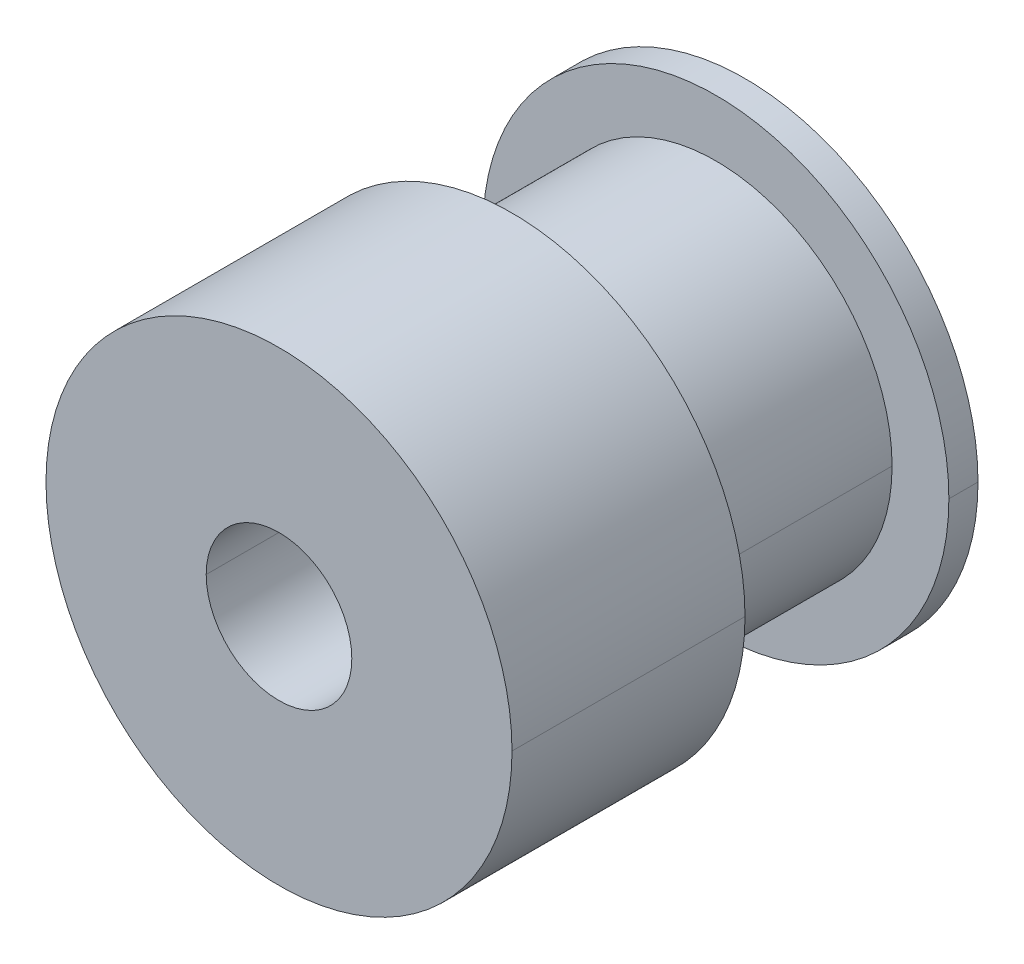
ISO-10303-21;
HEADER;
FILE_DESCRIPTION(('STEP AP214'),'2;1');
FILE_NAME('part.step','',(''),(''),'','','');
FILE_SCHEMA(('AUTOMOTIVE_DESIGN { 1 0 10303 214 1 1 1 1 }'));
ENDSEC;
DATA;
#1=APPLICATION_CONTEXT('core data for automotive mechanical design processes');
#2=APPLICATION_PROTOCOL_DEFINITION('international standard','automotive_design',2000,#1);
#3=PRODUCT_CONTEXT('',#1,'mechanical');
#4=PRODUCT('Part','Part','',(#3));
#5=PRODUCT_RELATED_PRODUCT_CATEGORY('part','',(#4));
#6=PRODUCT_DEFINITION_FORMATION('','',#4);
#7=PRODUCT_DEFINITION_CONTEXT('part definition',#1,'design');
#8=PRODUCT_DEFINITION('design','',#6,#7);
#9=PRODUCT_DEFINITION_SHAPE('','',#8);
#10=(LENGTH_UNIT() NAMED_UNIT(*) SI_UNIT(.MILLI.,.METRE.));
#11=(NAMED_UNIT(*) PLANE_ANGLE_UNIT() SI_UNIT($,.RADIAN.));
#12=(NAMED_UNIT(*) SI_UNIT($,.STERADIAN.) SOLID_ANGLE_UNIT());
#13=UNCERTAINTY_MEASURE_WITH_UNIT(LENGTH_MEASURE(1.E-05),#10,'distance_accuracy_value','');
#14=(GEOMETRIC_REPRESENTATION_CONTEXT(3) GLOBAL_UNCERTAINTY_ASSIGNED_CONTEXT((#13)) GLOBAL_UNIT_ASSIGNED_CONTEXT((#10,
#11,#12)) REPRESENTATION_CONTEXT('',''));
#15=CARTESIAN_POINT('',(0.,0.,0.));
#16=DIRECTION('',(0.,0.,1.));
#17=DIRECTION('',(1.,0.,0.));
#18=AXIS2_PLACEMENT_3D('',#15,#16,#17);
#19=CARTESIAN_POINT('',(0.,0.,8.));
#20=DIRECTION('',(0.,0.,1.));
#21=DIRECTION('',(1.,0.,0.));
#22=AXIS2_PLACEMENT_3D('',#19,#20,#21);
#23=CYLINDRICAL_SURFACE('',#22,8.);
#24=DIRECTION('',(0.,0.,1.));
#25=VECTOR('',#24,1.);
#26=CARTESIAN_POINT('',(-8.,0.,8.));
#27=LINE('',#26,#25);
#28=CARTESIAN_POINT('',(-8.,0.,0.));
#29=VERTEX_POINT('',#28);
#30=CARTESIAN_POINT('',(-8.,0.,1.));
#31=VERTEX_POINT('',#30);
#32=EDGE_CURVE('E39',#29,#31,#27,.T.);
#33=ORIENTED_EDGE('',*,*,#32,.F.);
#34=CARTESIAN_POINT('',(0.,0.,0.));
#35=DIRECTION('',(0.,0.,1.));
#36=DIRECTION('',(1.,0.,0.));
#37=AXIS2_PLACEMENT_3D('',#34,#35,#36);
#38=CIRCLE('',#37,8.);
#39=CARTESIAN_POINT('',(8.,0.,0.));
#40=VERTEX_POINT('',#39);
#41=EDGE_CURVE('E10',#29,#40,#38,.T.);
#42=ORIENTED_EDGE('',*,*,#41,.T.);
#43=DIRECTION('',(0.,0.,1.));
#44=VECTOR('',#43,1.);
#45=CARTESIAN_POINT('',(8.,0.,8.));
#46=LINE('',#45,#44);
#47=CARTESIAN_POINT('',(8.,0.,1.));
#48=VERTEX_POINT('',#47);
#49=EDGE_CURVE('E26',#40,#48,#46,.T.);
#50=ORIENTED_EDGE('',*,*,#49,.T.);
#51=CARTESIAN_POINT('',(0.,0.,1.));
#52=DIRECTION('',(0.,0.,1.));
#53=DIRECTION('',(1.,0.,0.));
#54=AXIS2_PLACEMENT_3D('',#51,#52,#53);
#55=CIRCLE('',#54,8.);
#56=EDGE_CURVE('E155',#31,#48,#55,.T.);
#57=ORIENTED_EDGE('',*,*,#56,.F.);
#58=EDGE_LOOP('',(#33,#42,#50,#57));
#59=FACE_BOUND('',#58,.T.);
#60=ADVANCED_FACE('F15',(#59),#23,.T.);
#61=CARTESIAN_POINT('',(0.,0.,8.));
#62=DIRECTION('',(0.,0.,1.));
#63=DIRECTION('',(1.,0.,0.));
#64=AXIS2_PLACEMENT_3D('',#61,#62,#63);
#65=CYLINDRICAL_SURFACE('',#64,8.);
#66=DIRECTION('',(0.,0.,1.));
#67=VECTOR('',#66,1.);
#68=CARTESIAN_POINT('',(8.,0.,8.));
#69=LINE('',#68,#67);
#70=CARTESIAN_POINT('',(8.,0.,8.));
#71=VERTEX_POINT('',#70);
#72=CARTESIAN_POINT('',(8.,0.,16.));
#73=VERTEX_POINT('',#72);
#74=EDGE_CURVE('E160',#71,#73,#69,.T.);
#75=ORIENTED_EDGE('',*,*,#74,.T.);
#76=CARTESIAN_POINT('',(0.,0.,16.));
#77=DIRECTION('',(0.,0.,1.));
#78=DIRECTION('',(1.,0.,0.));
#79=AXIS2_PLACEMENT_3D('',#76,#77,#78);
#80=CIRCLE('',#79,8.);
#81=CARTESIAN_POINT('',(-8.,0.,16.));
#82=VERTEX_POINT('',#81);
#83=EDGE_CURVE('E54',#82,#73,#80,.T.);
#84=ORIENTED_EDGE('',*,*,#83,.F.);
#85=DIRECTION('',(0.,0.,1.));
#86=VECTOR('',#85,1.);
#87=CARTESIAN_POINT('',(-8.,0.,8.));
#88=LINE('',#87,#86);
#89=CARTESIAN_POINT('',(-8.,0.,8.));
#90=VERTEX_POINT('',#89);
#91=EDGE_CURVE('E66',#90,#82,#88,.T.);
#92=ORIENTED_EDGE('',*,*,#91,.F.);
#93=CARTESIAN_POINT('',(0.,0.,8.));
#94=DIRECTION('',(0.,0.,1.));
#95=DIRECTION('',(1.,0.,0.));
#96=AXIS2_PLACEMENT_3D('',#93,#94,#95);
#97=CIRCLE('',#96,8.);
#98=EDGE_CURVE('E163',#90,#71,#97,.T.);
#99=ORIENTED_EDGE('',*,*,#98,.T.);
#100=EDGE_LOOP('',(#75,#84,#92,#99));
#101=FACE_BOUND('',#100,.T.);
#102=ADVANCED_FACE('F208',(#101),#65,.T.);
#103=CARTESIAN_POINT('',(0.,0.,8.));
#104=DIRECTION('',(0.,0.,1.));
#105=DIRECTION('',(1.,0.,0.));
#106=AXIS2_PLACEMENT_3D('',#103,#104,#105);
#107=CYLINDRICAL_SURFACE('',#106,8.);
#108=ORIENTED_EDGE('',*,*,#49,.F.);
#109=CARTESIAN_POINT('',(0.,0.,0.));
#110=DIRECTION('',(0.,0.,1.));
#111=DIRECTION('',(1.,0.,0.));
#112=AXIS2_PLACEMENT_3D('',#109,#110,#111);
#113=CIRCLE('',#112,8.);
#114=EDGE_CURVE('E166',#40,#29,#113,.T.);
#115=ORIENTED_EDGE('',*,*,#114,.T.);
#116=ORIENTED_EDGE('',*,*,#32,.T.);
#117=CARTESIAN_POINT('',(0.,0.,1.));
#118=DIRECTION('',(0.,0.,1.));
#119=DIRECTION('',(1.,0.,0.));
#120=AXIS2_PLACEMENT_3D('',#117,#118,#119);
#121=CIRCLE('',#120,8.);
#122=EDGE_CURVE('E151',#48,#31,#121,.T.);
#123=ORIENTED_EDGE('',*,*,#122,.F.);
#124=EDGE_LOOP('',(#108,#115,#116,#123));
#125=FACE_BOUND('',#124,.T.);
#126=ADVANCED_FACE('F187',(#125),#107,.T.);
#127=CARTESIAN_POINT('',(0.,0.,8.));
#128=DIRECTION('',(0.,0.,1.));
#129=DIRECTION('',(1.,0.,0.));
#130=AXIS2_PLACEMENT_3D('',#127,#128,#129);
#131=CYLINDRICAL_SURFACE('',#130,8.);
#132=ORIENTED_EDGE('',*,*,#91,.T.);
#133=CARTESIAN_POINT('',(0.,0.,16.));
#134=DIRECTION('',(0.,0.,1.));
#135=DIRECTION('',(1.,0.,0.));
#136=AXIS2_PLACEMENT_3D('',#133,#134,#135);
#137=CIRCLE('',#136,8.);
#138=EDGE_CURVE('E156',#73,#82,#137,.T.);
#139=ORIENTED_EDGE('',*,*,#138,.F.);
#140=ORIENTED_EDGE('',*,*,#74,.F.);
#141=CARTESIAN_POINT('',(0.,0.,8.));
#142=DIRECTION('',(0.,0.,1.));
#143=DIRECTION('',(1.,0.,0.));
#144=AXIS2_PLACEMENT_3D('',#141,#142,#143);
#145=CIRCLE('',#144,8.);
#146=EDGE_CURVE('E129',#71,#90,#145,.T.);
#147=ORIENTED_EDGE('',*,*,#146,.T.);
#148=EDGE_LOOP('',(#132,#139,#140,#147));
#149=FACE_BOUND('',#148,.T.);
#150=ADVANCED_FACE('F301',(#149),#131,.T.);
#151=CARTESIAN_POINT('',(0.,0.,8.));
#152=DIRECTION('',(0.,0.,1.));
#153=DIRECTION('',(1.,0.,0.));
#154=AXIS2_PLACEMENT_3D('',#151,#152,#153);
#155=PLANE('',#154);
#156=ORIENTED_EDGE('',*,*,#146,.F.);
#157=ORIENTED_EDGE('',*,*,#98,.F.);
#158=EDGE_LOOP('',(#156,#157));
#159=FACE_BOUND('',#158,.T.);
#160=CARTESIAN_POINT('',(0.,0.,8.));
#161=DIRECTION('',(0.,0.,1.));
#162=DIRECTION('',(1.,0.,0.));
#163=AXIS2_PLACEMENT_3D('',#160,#161,#162);
#164=CIRCLE('',#163,6.05023877008);
#165=CARTESIAN_POINT('',(6.05023877008,0.,8.));
#166=VERTEX_POINT('',#165);
#167=CARTESIAN_POINT('',(-6.05023877008,0.,8.));
#168=VERTEX_POINT('',#167);
#169=EDGE_CURVE('E119',#166,#168,#164,.T.);
#170=ORIENTED_EDGE('',*,*,#169,.T.);
#171=CARTESIAN_POINT('',(0.,0.,8.));
#172=DIRECTION('',(0.,0.,1.));
#173=DIRECTION('',(1.,0.,0.));
#174=AXIS2_PLACEMENT_3D('',#171,#172,#173);
#175=CIRCLE('',#174,6.05023877008);
#176=EDGE_CURVE('E117',#168,#166,#175,.T.);
#177=ORIENTED_EDGE('',*,*,#176,.T.);
#178=EDGE_LOOP('',(#170,#177));
#179=FACE_BOUND('',#178,.T.);
#180=ADVANCED_FACE('F17',(#159,#179),#155,.F.);
#181=CARTESIAN_POINT('',(0.,0.,4.5));
#182=DIRECTION('',(0.,0.,1.));
#183=DIRECTION('',(1.,0.,0.));
#184=AXIS2_PLACEMENT_3D('',#181,#182,#183);
#185=CYLINDRICAL_SURFACE('',#184,6.05023877008);
#186=DIRECTION('',(0.,0.,1.));
#187=VECTOR('',#186,1.);
#188=CARTESIAN_POINT('',(-6.05023877008,0.,4.5));
#189=LINE('',#188,#187);
#190=CARTESIAN_POINT('',(-6.05023877008,0.,1.));
#191=VERTEX_POINT('',#190);
#192=EDGE_CURVE('E19',#191,#168,#189,.T.);
#193=ORIENTED_EDGE('',*,*,#192,.F.);
#194=CARTESIAN_POINT('',(0.,0.,1.));
#195=DIRECTION('',(0.,0.,1.));
#196=DIRECTION('',(1.,0.,0.));
#197=AXIS2_PLACEMENT_3D('',#194,#195,#196);
#198=CIRCLE('',#197,6.05023877008);
#199=CARTESIAN_POINT('',(6.05023877008,0.,1.));
#200=VERTEX_POINT('',#199);
#201=EDGE_CURVE('E122',#191,#200,#198,.T.);
#202=ORIENTED_EDGE('',*,*,#201,.T.);
#203=DIRECTION('',(0.,0.,1.));
#204=VECTOR('',#203,1.);
#205=CARTESIAN_POINT('',(6.05023877008,0.,4.5));
#206=LINE('',#205,#204);
#207=EDGE_CURVE('E127',#200,#166,#206,.T.);
#208=ORIENTED_EDGE('',*,*,#207,.T.);
#209=ORIENTED_EDGE('',*,*,#176,.F.);
#210=EDGE_LOOP('',(#193,#202,#208,#209));
#211=FACE_BOUND('',#210,.T.);
#212=ADVANCED_FACE('F131',(#211),#185,.T.);
#213=CARTESIAN_POINT('',(0.,0.,4.5));
#214=DIRECTION('',(0.,0.,1.));
#215=DIRECTION('',(1.,0.,0.));
#216=AXIS2_PLACEMENT_3D('',#213,#214,#215);
#217=CYLINDRICAL_SURFACE('',#216,6.05023877008);
#218=ORIENTED_EDGE('',*,*,#207,.F.);
#219=CARTESIAN_POINT('',(0.,0.,1.));
#220=DIRECTION('',(0.,0.,1.));
#221=DIRECTION('',(1.,0.,0.));
#222=AXIS2_PLACEMENT_3D('',#219,#220,#221);
#223=CIRCLE('',#222,6.05023877008);
#224=EDGE_CURVE('E134',#200,#191,#223,.T.);
#225=ORIENTED_EDGE('',*,*,#224,.T.);
#226=ORIENTED_EDGE('',*,*,#192,.T.);
#227=ORIENTED_EDGE('',*,*,#169,.F.);
#228=EDGE_LOOP('',(#218,#225,#226,#227));
#229=FACE_BOUND('',#228,.T.);
#230=ADVANCED_FACE('F125',(#229),#217,.T.);
#231=CARTESIAN_POINT('',(0.,0.,1.));
#232=DIRECTION('',(0.,0.,1.));
#233=DIRECTION('',(1.,0.,0.));
#234=AXIS2_PLACEMENT_3D('',#231,#232,#233);
#235=PLANE('',#234);
#236=ORIENTED_EDGE('',*,*,#56,.T.);
#237=ORIENTED_EDGE('',*,*,#122,.T.);
#238=EDGE_LOOP('',(#236,#237));
#239=FACE_BOUND('',#238,.T.);
#240=ORIENTED_EDGE('',*,*,#201,.F.);
#241=ORIENTED_EDGE('',*,*,#224,.F.);
#242=EDGE_LOOP('',(#240,#241));
#243=FACE_BOUND('',#242,.T.);
#244=ADVANCED_FACE('F193',(#239,#243),#235,.T.);
#245=CARTESIAN_POINT('',(0.,0.,16.));
#246=DIRECTION('',(0.,0.,1.));
#247=DIRECTION('',(1.,0.,0.));
#248=AXIS2_PLACEMENT_3D('',#245,#246,#247);
#249=PLANE('',#248);
#250=ORIENTED_EDGE('',*,*,#138,.T.);
#251=ORIENTED_EDGE('',*,*,#83,.T.);
#252=EDGE_LOOP('',(#250,#251));
#253=FACE_BOUND('',#252,.T.);
#254=CARTESIAN_POINT('',(0.,0.,16.));
#255=DIRECTION('',(0.,0.,1.));
#256=DIRECTION('',(1.,0.,0.));
#257=AXIS2_PLACEMENT_3D('',#254,#255,#256);
#258=CIRCLE('',#257,2.5);
#259=CARTESIAN_POINT('',(-2.5,0.,16.));
#260=VERTEX_POINT('',#259);
#261=CARTESIAN_POINT('',(2.5,0.,16.));
#262=VERTEX_POINT('',#261);
#263=EDGE_CURVE('E86',#260,#262,#258,.T.);
#264=ORIENTED_EDGE('',*,*,#263,.F.);
#265=CARTESIAN_POINT('',(0.,0.,16.));
#266=DIRECTION('',(0.,0.,1.));
#267=DIRECTION('',(1.,0.,0.));
#268=AXIS2_PLACEMENT_3D('',#265,#266,#267);
#269=CIRCLE('',#268,2.5);
#270=EDGE_CURVE('E149',#262,#260,#269,.T.);
#271=ORIENTED_EDGE('',*,*,#270,.F.);
#272=EDGE_LOOP('',(#264,#271));
#273=FACE_BOUND('',#272,.T.);
#274=ADVANCED_FACE('F196',(#253,#273),#249,.T.);
#275=CARTESIAN_POINT('',(0.,0.,0.));
#276=DIRECTION('',(0.,0.,1.));
#277=DIRECTION('',(1.,0.,0.));
#278=AXIS2_PLACEMENT_3D('',#275,#276,#277);
#279=PLANE('',#278);
#280=ORIENTED_EDGE('',*,*,#41,.F.);
#281=ORIENTED_EDGE('',*,*,#114,.F.);
#282=EDGE_LOOP('',(#280,#281));
#283=FACE_BOUND('',#282,.T.);
#284=CARTESIAN_POINT('',(0.,0.,0.));
#285=DIRECTION('',(0.,0.,-1.));
#286=DIRECTION('',(1.,0.,0.));
#287=AXIS2_PLACEMENT_3D('',#284,#285,#286);
#288=CIRCLE('',#287,2.5);
#289=CARTESIAN_POINT('',(-2.5,0.,0.));
#290=VERTEX_POINT('',#289);
#291=CARTESIAN_POINT('',(2.5,0.,0.));
#292=VERTEX_POINT('',#291);
#293=EDGE_CURVE('E145',#290,#292,#288,.T.);
#294=ORIENTED_EDGE('',*,*,#293,.F.);
#295=CARTESIAN_POINT('',(0.,0.,0.));
#296=DIRECTION('',(0.,0.,-1.));
#297=DIRECTION('',(1.,0.,0.));
#298=AXIS2_PLACEMENT_3D('',#295,#296,#297);
#299=CIRCLE('',#298,2.5);
#300=EDGE_CURVE('E173',#292,#290,#299,.T.);
#301=ORIENTED_EDGE('',*,*,#300,.F.);
#302=EDGE_LOOP('',(#294,#301));
#303=FACE_BOUND('',#302,.T.);
#304=ADVANCED_FACE('F190',(#283,#303),#279,.F.);
#305=CARTESIAN_POINT('',(0.,0.,15.));
#306=DIRECTION('',(0.,0.,-1.));
#307=DIRECTION('',(1.,0.,0.));
#308=AXIS2_PLACEMENT_3D('',#305,#306,#307);
#309=CYLINDRICAL_SURFACE('',#308,2.5);
#310=ORIENTED_EDGE('',*,*,#270,.T.);
#311=DIRECTION('',(0.,0.,1.));
#312=VECTOR('',#311,1.);
#313=CARTESIAN_POINT('',(-2.5,0.,15.));
#314=LINE('',#313,#312);
#315=EDGE_CURVE('E170',#290,#260,#314,.T.);
#316=ORIENTED_EDGE('',*,*,#315,.F.);
#317=ORIENTED_EDGE('',*,*,#293,.T.);
#318=DIRECTION('',(0.,0.,1.));
#319=VECTOR('',#318,1.);
#320=CARTESIAN_POINT('',(2.5,0.,15.));
#321=LINE('',#320,#319);
#322=EDGE_CURVE('E150',#292,#262,#321,.T.);
#323=ORIENTED_EDGE('',*,*,#322,.T.);
#324=EDGE_LOOP('',(#310,#316,#317,#323));
#325=FACE_BOUND('',#324,.T.);
#326=ADVANCED_FACE('F215',(#325),#309,.F.);
#327=CARTESIAN_POINT('',(0.,0.,15.));
#328=DIRECTION('',(0.,0.,-1.));
#329=DIRECTION('',(1.,0.,0.));
#330=AXIS2_PLACEMENT_3D('',#327,#328,#329);
#331=CYLINDRICAL_SURFACE('',#330,2.5);
#332=ORIENTED_EDGE('',*,*,#263,.T.);
#333=ORIENTED_EDGE('',*,*,#322,.F.);
#334=ORIENTED_EDGE('',*,*,#300,.T.);
#335=ORIENTED_EDGE('',*,*,#315,.T.);
#336=EDGE_LOOP('',(#332,#333,#334,#335));
#337=FACE_BOUND('',#336,.T.);
#338=ADVANCED_FACE('F217',(#337),#331,.F.);
#339=CLOSED_SHELL('',(#60,#102,#126,#150,#180,#212,#230,#244,#274,#304,#326,#338));
#340=MANIFOLD_SOLID_BREP('B1',#339);
#341=ADVANCED_BREP_SHAPE_REPRESENTATION('',(#18,#340),#14);
#342=SHAPE_DEFINITION_REPRESENTATION(#9,#341);
ENDSEC;
END-ISO-10303-21;
